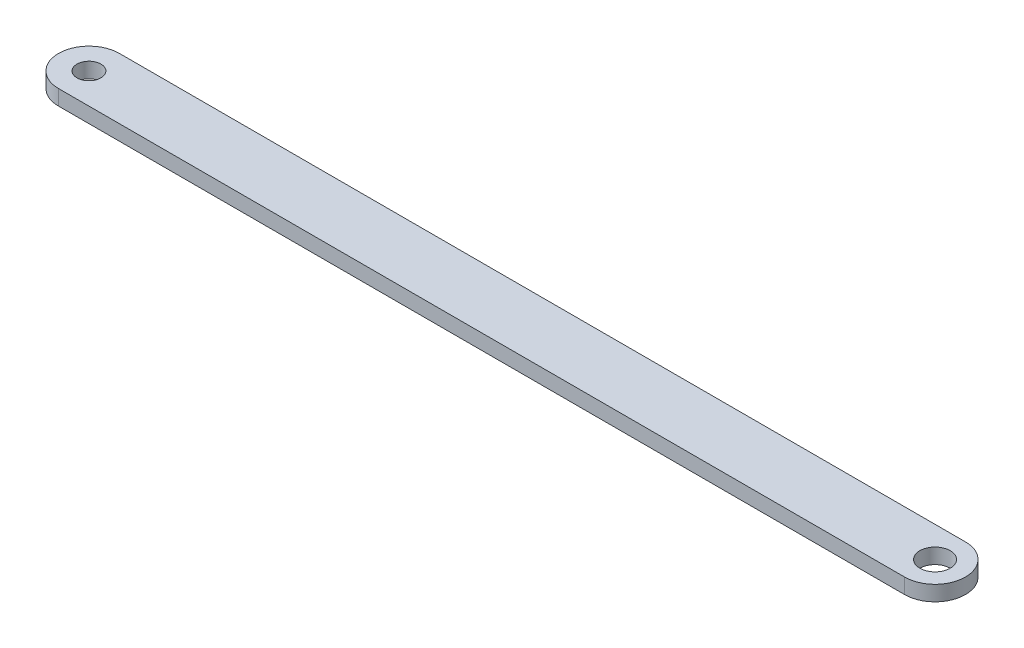
ISO-10303-21;
HEADER;
FILE_DESCRIPTION(('STEP AP214'),'2;1');
FILE_NAME('part.step','',(''),(''),'','','');
FILE_SCHEMA(('AUTOMOTIVE_DESIGN { 1 0 10303 214 1 1 1 1 }'));
ENDSEC;
DATA;
#1=APPLICATION_CONTEXT('core data for automotive mechanical design processes');
#2=APPLICATION_PROTOCOL_DEFINITION('international standard','automotive_design',2000,#1);
#3=PRODUCT_CONTEXT('',#1,'mechanical');
#4=PRODUCT('Part','Part','',(#3));
#5=PRODUCT_RELATED_PRODUCT_CATEGORY('part','',(#4));
#6=PRODUCT_DEFINITION_FORMATION('','',#4);
#7=PRODUCT_DEFINITION_CONTEXT('part definition',#1,'design');
#8=PRODUCT_DEFINITION('design','',#6,#7);
#9=PRODUCT_DEFINITION_SHAPE('','',#8);
#10=(LENGTH_UNIT() NAMED_UNIT(*) SI_UNIT(.MILLI.,.METRE.));
#11=(NAMED_UNIT(*) PLANE_ANGLE_UNIT() SI_UNIT($,.RADIAN.));
#12=(NAMED_UNIT(*) SI_UNIT($,.STERADIAN.) SOLID_ANGLE_UNIT());
#13=UNCERTAINTY_MEASURE_WITH_UNIT(LENGTH_MEASURE(1.E-05),#10,'distance_accuracy_value','');
#14=(GEOMETRIC_REPRESENTATION_CONTEXT(3) GLOBAL_UNCERTAINTY_ASSIGNED_CONTEXT((#13)) GLOBAL_UNIT_ASSIGNED_CONTEXT((#10,
#11,#12)) REPRESENTATION_CONTEXT('',''));
#15=CARTESIAN_POINT('',(0.,0.,0.));
#16=DIRECTION('',(0.,0.,1.));
#17=DIRECTION('',(1.,0.,0.));
#18=AXIS2_PLACEMENT_3D('',#15,#16,#17);
#19=CARTESIAN_POINT('',(0.,3.175,0.));
#20=DIRECTION('',(0.,1.,0.));
#21=DIRECTION('',(0.,0.,1.));
#22=AXIS2_PLACEMENT_3D('',#19,#20,#21);
#23=PLANE('',#22);
#24=CARTESIAN_POINT('',(0.,3.175,0.));
#25=DIRECTION('',(0.,1.,0.));
#26=DIRECTION('',(0.,0.,1.));
#27=AXIS2_PLACEMENT_3D('',#24,#25,#26);
#28=CIRCLE('',#27,2.5);
#29=CARTESIAN_POINT('',(0.,3.175,2.5));
#30=VERTEX_POINT('',#29);
#31=EDGE_CURVE('E112',#30,#30,#28,.T.);
#32=ORIENTED_EDGE('',*,*,#31,.F.);
#33=EDGE_LOOP('',(#32));
#34=FACE_BOUND('',#33,.T.);
#35=CARTESIAN_POINT('',(0.,3.175,0.));
#36=DIRECTION('',(0.,1.,0.));
#37=DIRECTION('',(0.,0.,1.));
#38=AXIS2_PLACEMENT_3D('',#35,#36,#37);
#39=CIRCLE('',#38,6.35);
#40=CARTESIAN_POINT('',(0.,3.175,-6.35));
#41=VERTEX_POINT('',#40);
#42=CARTESIAN_POINT('',(0.,3.175,6.35));
#43=VERTEX_POINT('',#42);
#44=EDGE_CURVE('E92',#41,#43,#39,.T.);
#45=ORIENTED_EDGE('',*,*,#44,.T.);
#46=DIRECTION('',(1.,0.,0.));
#47=VECTOR('',#46,1.);
#48=CARTESIAN_POINT('',(0.,3.175,6.35));
#49=LINE('',#48,#47);
#50=CARTESIAN_POINT('',(176.54778,3.175,6.35));
#51=VERTEX_POINT('',#50);
#52=EDGE_CURVE('E87',#43,#51,#49,.T.);
#53=ORIENTED_EDGE('',*,*,#52,.T.);
#54=CARTESIAN_POINT('',(176.54778,3.175,0.));
#55=DIRECTION('',(0.,1.,0.));
#56=DIRECTION('',(0.,0.,1.));
#57=AXIS2_PLACEMENT_3D('',#54,#55,#56);
#58=CIRCLE('',#57,6.35);
#59=CARTESIAN_POINT('',(176.54778,3.175,-6.35));
#60=VERTEX_POINT('',#59);
#61=EDGE_CURVE('E90',#51,#60,#58,.T.);
#62=ORIENTED_EDGE('',*,*,#61,.T.);
#63=DIRECTION('',(-1.,0.,0.));
#64=VECTOR('',#63,1.);
#65=CARTESIAN_POINT('',(0.,3.175,-6.35));
#66=LINE('',#65,#64);
#67=EDGE_CURVE('E57',#60,#41,#66,.T.);
#68=ORIENTED_EDGE('',*,*,#67,.T.);
#69=EDGE_LOOP('',(#45,#53,#62,#68));
#70=FACE_BOUND('',#69,.T.);
#71=CARTESIAN_POINT('',(176.54778,3.175,0.));
#72=DIRECTION('',(0.,1.,0.));
#73=DIRECTION('',(0.,0.,1.));
#74=AXIS2_PLACEMENT_3D('',#71,#72,#73);
#75=CIRCLE('',#74,3.175);
#76=CARTESIAN_POINT('',(176.54778,3.175,3.175));
#77=VERTEX_POINT('',#76);
#78=EDGE_CURVE('E134',#77,#77,#75,.T.);
#79=ORIENTED_EDGE('',*,*,#78,.F.);
#80=EDGE_LOOP('',(#79));
#81=FACE_BOUND('',#80,.T.);
#82=ADVANCED_FACE('F39',(#34,#70,#81),#23,.T.);
#83=CARTESIAN_POINT('',(0.,0.,0.));
#84=DIRECTION('',(0.,1.,0.));
#85=DIRECTION('',(0.,0.,1.));
#86=AXIS2_PLACEMENT_3D('',#83,#84,#85);
#87=PLANE('',#86);
#88=CARTESIAN_POINT('',(0.,0.,0.));
#89=DIRECTION('',(0.,1.,0.));
#90=DIRECTION('',(0.,0.,1.));
#91=AXIS2_PLACEMENT_3D('',#88,#89,#90);
#92=CIRCLE('',#91,6.35);
#93=CARTESIAN_POINT('',(0.,0.,-6.35));
#94=VERTEX_POINT('',#93);
#95=CARTESIAN_POINT('',(0.,0.,6.35));
#96=VERTEX_POINT('',#95);
#97=EDGE_CURVE('E108',#94,#96,#92,.T.);
#98=ORIENTED_EDGE('',*,*,#97,.F.);
#99=DIRECTION('',(-1.,0.,0.));
#100=VECTOR('',#99,1.);
#101=CARTESIAN_POINT('',(0.,0.,-6.35));
#102=LINE('',#101,#100);
#103=CARTESIAN_POINT('',(176.54778,0.,-6.35));
#104=VERTEX_POINT('',#103);
#105=EDGE_CURVE('E80',#104,#94,#102,.T.);
#106=ORIENTED_EDGE('',*,*,#105,.F.);
#107=CARTESIAN_POINT('',(176.54778,0.,0.));
#108=DIRECTION('',(0.,1.,0.));
#109=DIRECTION('',(0.,0.,1.));
#110=AXIS2_PLACEMENT_3D('',#107,#108,#109);
#111=CIRCLE('',#110,6.35);
#112=CARTESIAN_POINT('',(176.54778,0.,6.35));
#113=VERTEX_POINT('',#112);
#114=EDGE_CURVE('E74',#113,#104,#111,.T.);
#115=ORIENTED_EDGE('',*,*,#114,.F.);
#116=DIRECTION('',(1.,0.,0.));
#117=VECTOR('',#116,1.);
#118=CARTESIAN_POINT('',(0.,0.,6.35));
#119=LINE('',#118,#117);
#120=EDGE_CURVE('E97',#96,#113,#119,.T.);
#121=ORIENTED_EDGE('',*,*,#120,.F.);
#122=EDGE_LOOP('',(#98,#106,#115,#121));
#123=FACE_BOUND('',#122,.T.);
#124=CARTESIAN_POINT('',(0.,0.,0.));
#125=DIRECTION('',(0.,1.,0.));
#126=DIRECTION('',(0.,0.,1.));
#127=AXIS2_PLACEMENT_3D('',#124,#125,#126);
#128=CIRCLE('',#127,2.5);
#129=CARTESIAN_POINT('',(0.,0.,2.5));
#130=VERTEX_POINT('',#129);
#131=EDGE_CURVE('E130',#130,#130,#128,.T.);
#132=ORIENTED_EDGE('',*,*,#131,.T.);
#133=EDGE_LOOP('',(#132));
#134=FACE_BOUND('',#133,.T.);
#135=CARTESIAN_POINT('',(176.54778,0.,0.));
#136=DIRECTION('',(0.,1.,0.));
#137=DIRECTION('',(0.,0.,1.));
#138=AXIS2_PLACEMENT_3D('',#135,#136,#137);
#139=CIRCLE('',#138,3.175);
#140=CARTESIAN_POINT('',(176.54778,0.,3.175));
#141=VERTEX_POINT('',#140);
#142=EDGE_CURVE('E138',#141,#141,#139,.T.);
#143=ORIENTED_EDGE('',*,*,#142,.T.);
#144=EDGE_LOOP('',(#143));
#145=FACE_BOUND('',#144,.T.);
#146=ADVANCED_FACE('F125',(#123,#134,#145),#87,.F.);
#147=CARTESIAN_POINT('',(0.,3.175,0.));
#148=DIRECTION('',(0.,-1.,0.));
#149=DIRECTION('',(0.,0.,-1.));
#150=AXIS2_PLACEMENT_3D('',#147,#148,#149);
#151=CYLINDRICAL_SURFACE('',#150,6.35);
#152=ORIENTED_EDGE('',*,*,#97,.T.);
#153=DIRECTION('',(0.,-1.,0.));
#154=VECTOR('',#153,1.);
#155=CARTESIAN_POINT('',(0.,3.175,6.35));
#156=LINE('',#155,#154);
#157=EDGE_CURVE('E11',#43,#96,#156,.T.);
#158=ORIENTED_EDGE('',*,*,#157,.F.);
#159=ORIENTED_EDGE('',*,*,#44,.F.);
#160=DIRECTION('',(0.,-1.,0.));
#161=VECTOR('',#160,1.);
#162=CARTESIAN_POINT('',(0.,3.175,-6.35));
#163=LINE('',#162,#161);
#164=EDGE_CURVE('E104',#41,#94,#163,.T.);
#165=ORIENTED_EDGE('',*,*,#164,.T.);
#166=EDGE_LOOP('',(#152,#158,#159,#165));
#167=FACE_BOUND('',#166,.T.);
#168=ADVANCED_FACE('F41',(#167),#151,.T.);
#169=CARTESIAN_POINT('',(0.,3.175,6.35));
#170=DIRECTION('',(0.,0.,-1.));
#171=DIRECTION('',(-1.,0.,0.));
#172=AXIS2_PLACEMENT_3D('',#169,#170,#171);
#173=PLANE('',#172);
#174=ORIENTED_EDGE('',*,*,#120,.T.);
#175=DIRECTION('',(0.,-1.,0.));
#176=VECTOR('',#175,1.);
#177=CARTESIAN_POINT('',(176.54778,3.175,6.35));
#178=LINE('',#177,#176);
#179=EDGE_CURVE('E49',#51,#113,#178,.T.);
#180=ORIENTED_EDGE('',*,*,#179,.F.);
#181=ORIENTED_EDGE('',*,*,#52,.F.);
#182=ORIENTED_EDGE('',*,*,#157,.T.);
#183=EDGE_LOOP('',(#174,#180,#181,#182));
#184=FACE_BOUND('',#183,.T.);
#185=ADVANCED_FACE('F96',(#184),#173,.F.);
#186=CARTESIAN_POINT('',(176.54778,3.175,0.));
#187=DIRECTION('',(0.,-1.,0.));
#188=DIRECTION('',(0.,0.,-1.));
#189=AXIS2_PLACEMENT_3D('',#186,#187,#188);
#190=CYLINDRICAL_SURFACE('',#189,6.35);
#191=ORIENTED_EDGE('',*,*,#114,.T.);
#192=DIRECTION('',(0.,-1.,0.));
#193=VECTOR('',#192,1.);
#194=CARTESIAN_POINT('',(176.54778,3.175,-6.35));
#195=LINE('',#194,#193);
#196=EDGE_CURVE('E99',#60,#104,#195,.T.);
#197=ORIENTED_EDGE('',*,*,#196,.F.);
#198=ORIENTED_EDGE('',*,*,#61,.F.);
#199=ORIENTED_EDGE('',*,*,#179,.T.);
#200=EDGE_LOOP('',(#191,#197,#198,#199));
#201=FACE_BOUND('',#200,.T.);
#202=ADVANCED_FACE('F100',(#201),#190,.T.);
#203=CARTESIAN_POINT('',(0.,3.175,-6.35));
#204=DIRECTION('',(0.,0.,1.));
#205=DIRECTION('',(1.,0.,0.));
#206=AXIS2_PLACEMENT_3D('',#203,#204,#205);
#207=PLANE('',#206);
#208=ORIENTED_EDGE('',*,*,#105,.T.);
#209=ORIENTED_EDGE('',*,*,#164,.F.);
#210=ORIENTED_EDGE('',*,*,#67,.F.);
#211=ORIENTED_EDGE('',*,*,#196,.T.);
#212=EDGE_LOOP('',(#208,#209,#210,#211));
#213=FACE_BOUND('',#212,.T.);
#214=ADVANCED_FACE('F122',(#213),#207,.F.);
#215=CARTESIAN_POINT('',(0.,3.175,0.));
#216=DIRECTION('',(0.,-1.,0.));
#217=DIRECTION('',(0.,0.,-1.));
#218=AXIS2_PLACEMENT_3D('',#215,#216,#217);
#219=CYLINDRICAL_SURFACE('',#218,2.5);
#220=ORIENTED_EDGE('',*,*,#31,.T.);
#221=EDGE_LOOP('',(#220));
#222=FACE_BOUND('',#221,.T.);
#223=ORIENTED_EDGE('',*,*,#131,.F.);
#224=EDGE_LOOP('',(#223));
#225=FACE_BOUND('',#224,.T.);
#226=ADVANCED_FACE('F157',(#222,#225),#219,.F.);
#227=CARTESIAN_POINT('',(176.54778,3.175,0.));
#228=DIRECTION('',(0.,-1.,0.));
#229=DIRECTION('',(0.,0.,-1.));
#230=AXIS2_PLACEMENT_3D('',#227,#228,#229);
#231=CYLINDRICAL_SURFACE('',#230,3.175);
#232=ORIENTED_EDGE('',*,*,#78,.T.);
#233=EDGE_LOOP('',(#232));
#234=FACE_BOUND('',#233,.T.);
#235=ORIENTED_EDGE('',*,*,#142,.F.);
#236=EDGE_LOOP('',(#235));
#237=FACE_BOUND('',#236,.T.);
#238=ADVANCED_FACE('F146',(#234,#237),#231,.F.);
#239=CLOSED_SHELL('',(#82,#146,#168,#185,#202,#214,#226,#238));
#240=MANIFOLD_SOLID_BREP('B2',#239);
#241=ADVANCED_BREP_SHAPE_REPRESENTATION('',(#18,#240),#14);
#242=SHAPE_DEFINITION_REPRESENTATION(#9,#241);
ENDSEC;
END-ISO-10303-21;
